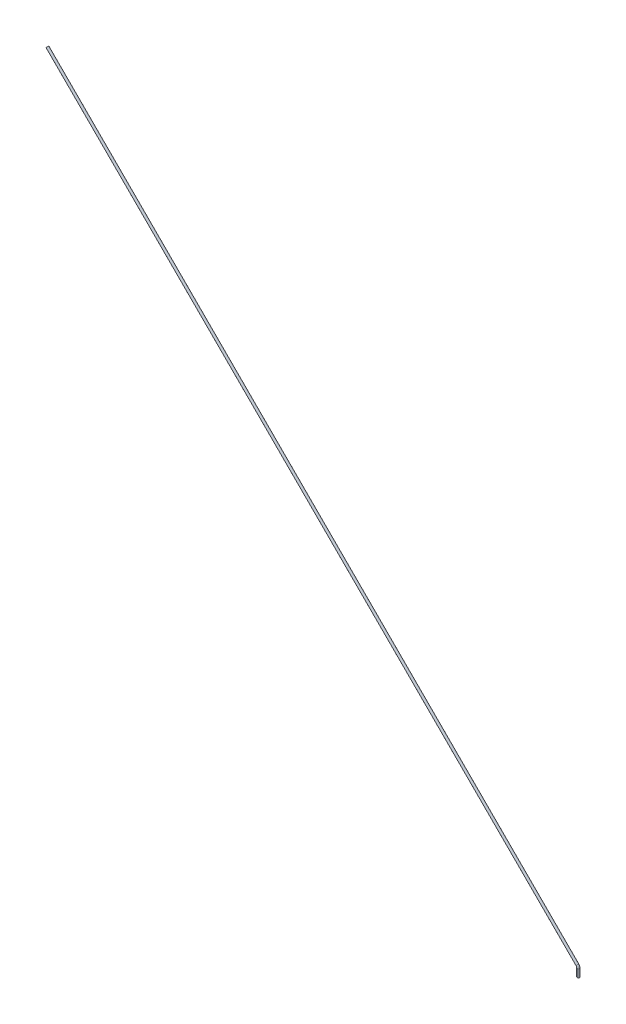
ISO-10303-21;
HEADER;
FILE_DESCRIPTION(('STEP AP214'),'2;1');
FILE_NAME('part.step','',(''),(''),'','','');
FILE_SCHEMA(('AUTOMOTIVE_DESIGN { 1 0 10303 214 1 1 1 1 }'));
ENDSEC;
DATA;
#1=APPLICATION_CONTEXT('core data for automotive mechanical design processes');
#2=APPLICATION_PROTOCOL_DEFINITION('international standard','automotive_design',2000,#1);
#3=PRODUCT_CONTEXT('',#1,'mechanical');
#4=PRODUCT('Part','Part','',(#3));
#5=PRODUCT_RELATED_PRODUCT_CATEGORY('part','',(#4));
#6=PRODUCT_DEFINITION_FORMATION('','',#4);
#7=PRODUCT_DEFINITION_CONTEXT('part definition',#1,'design');
#8=PRODUCT_DEFINITION('design','',#6,#7);
#9=PRODUCT_DEFINITION_SHAPE('','',#8);
#10=(LENGTH_UNIT() NAMED_UNIT(*) SI_UNIT(.MILLI.,.METRE.));
#11=(NAMED_UNIT(*) PLANE_ANGLE_UNIT() SI_UNIT($,.RADIAN.));
#12=(NAMED_UNIT(*) SI_UNIT($,.STERADIAN.) SOLID_ANGLE_UNIT());
#13=UNCERTAINTY_MEASURE_WITH_UNIT(LENGTH_MEASURE(1.E-05),#10,'distance_accuracy_value','');
#14=(GEOMETRIC_REPRESENTATION_CONTEXT(3) GLOBAL_UNCERTAINTY_ASSIGNED_CONTEXT((#13)) GLOBAL_UNIT_ASSIGNED_CONTEXT((#10,
#11,#12)) REPRESENTATION_CONTEXT('',''));
#15=CARTESIAN_POINT('',(0.,0.,0.));
#16=DIRECTION('',(0.,0.,1.));
#17=DIRECTION('',(1.,0.,0.));
#18=AXIS2_PLACEMENT_3D('',#15,#16,#17);
#19=CARTESIAN_POINT('',(-0.21966991411009,2.21966991411009,0.));
#20=DIRECTION('',(-0.707106781186549,0.707106781186546,0.));
#21=DIRECTION('',(-0.707106781186546,-0.707106781186549,0.));
#22=AXIS2_PLACEMENT_3D('',#19,#20,#21);
#23=CYLINDRICAL_SURFACE('',#22,0.25);
#24=CARTESIAN_POINT('',(-0.21966991411009,2.21966991411009,0.));
#25=DIRECTION('',(-0.707106781186549,0.707106781186546,0.));
#26=DIRECTION('',(0.,0.,1.));
#27=AXIS2_PLACEMENT_3D('',#24,#25,#26);
#28=CIRCLE('',#27,0.25);
#29=CARTESIAN_POINT('',(-0.042893218813454,2.39644660940673,0.));
#30=VERTEX_POINT('',#29);
#31=EDGE_CURVE('E37',#30,#30,#28,.T.);
#32=ORIENTED_EDGE('',*,*,#31,.T.);
#33=EDGE_LOOP('',(#32));
#34=FACE_BOUND('',#33,.T.);
#35=CARTESIAN_POINT('',(-115.258405333407,117.258405333407,0.));
#36=DIRECTION('',(-0.707106781186549,0.707106781186546,0.));
#37=DIRECTION('',(0.,0.,1.));
#38=AXIS2_PLACEMENT_3D('',#35,#36,#37);
#39=CIRCLE('',#38,0.25);
#40=CARTESIAN_POINT('',(-115.258405333407,117.258405333407,0.25));
#41=VERTEX_POINT('',#40);
#42=EDGE_CURVE('E10',#41,#41,#39,.T.);
#43=ORIENTED_EDGE('',*,*,#42,.F.);
#44=EDGE_LOOP('',(#43));
#45=FACE_BOUND('',#44,.T.);
#46=ADVANCED_FACE('F31',(#34,#45),#23,.T.);
#47=CARTESIAN_POINT('',(-0.75,1.68933982822018,0.));
#48=DIRECTION('',(0.,0.,1.));
#49=DIRECTION('',(1.,0.,0.));
#50=AXIS2_PLACEMENT_3D('',#47,#48,#49);
#51=TOROIDAL_SURFACE('',#50,0.75,0.25);
#52=CARTESIAN_POINT('',(0.,1.68933982822018,0.));
#53=DIRECTION('',(0.,1.,0.));
#54=DIRECTION('',(0.,0.,1.));
#55=AXIS2_PLACEMENT_3D('',#52,#53,#54);
#56=CIRCLE('',#55,0.25);
#57=CARTESIAN_POINT('',(0.25,1.68933982822018,0.));
#58=VERTEX_POINT('',#57);
#59=EDGE_CURVE('E41',#58,#58,#56,.T.);
#60=CARTESIAN_POINT('',(-0.75,1.68933982822018,0.));
#61=DIRECTION('',(0.,0.,1.));
#62=DIRECTION('',(1.,0.,0.));
#63=AXIS2_PLACEMENT_3D('',#60,#61,#62);
#64=CIRCLE('',#63,1.);
#65=EDGE_CURVE('',#58,#30,#64,.T.);
#66=ORIENTED_EDGE('',*,*,#59,.T.);
#67=ORIENTED_EDGE('',*,*,#31,.F.);
#68=ORIENTED_EDGE('',*,*,#65,.T.);
#69=ORIENTED_EDGE('',*,*,#65,.F.);
#70=EDGE_LOOP('',(#66,#68,#67,#69));
#71=FACE_BOUND('',#70,.T.);
#72=ADVANCED_FACE('F63',(#71),#51,.T.);
#73=CARTESIAN_POINT('',(0.,1.68933982822018,0.));
#74=DIRECTION('',(0.,-1.,0.));
#75=DIRECTION('',(1.,0.,0.));
#76=AXIS2_PLACEMENT_3D('',#73,#74,#75);
#77=CYLINDRICAL_SURFACE('',#76,0.25);
#78=ORIENTED_EDGE('',*,*,#59,.F.);
#79=EDGE_LOOP('',(#78));
#80=FACE_BOUND('',#79,.T.);
#81=CARTESIAN_POINT('',(0.,0.,0.));
#82=DIRECTION('',(0.,1.,0.));
#83=DIRECTION('',(0.,0.,1.));
#84=AXIS2_PLACEMENT_3D('',#81,#82,#83);
#85=CIRCLE('',#84,0.25);
#86=CARTESIAN_POINT('',(0.,0.,0.25));
#87=VERTEX_POINT('',#86);
#88=EDGE_CURVE('E45',#87,#87,#85,.T.);
#89=ORIENTED_EDGE('',*,*,#88,.T.);
#90=EDGE_LOOP('',(#89));
#91=FACE_BOUND('',#90,.T.);
#92=ADVANCED_FACE('F51',(#80,#91),#77,.T.);
#93=CARTESIAN_POINT('',(-115.258405333407,117.258405333407,0.));
#94=DIRECTION('',(-0.707106781186549,0.707106781186546,0.));
#95=DIRECTION('',(0.,0.,1.));
#96=AXIS2_PLACEMENT_3D('',#93,#94,#95);
#97=PLANE('',#96);
#98=ORIENTED_EDGE('',*,*,#42,.T.);
#99=EDGE_LOOP('',(#98));
#100=FACE_BOUND('',#99,.T.);
#101=ADVANCED_FACE('F55',(#100),#97,.T.);
#102=CARTESIAN_POINT('',(0.,0.,0.));
#103=DIRECTION('',(0.,1.,0.));
#104=DIRECTION('',(0.,0.,1.));
#105=AXIS2_PLACEMENT_3D('',#102,#103,#104);
#106=PLANE('',#105);
#107=ORIENTED_EDGE('',*,*,#88,.F.);
#108=EDGE_LOOP('',(#107));
#109=FACE_BOUND('',#108,.T.);
#110=ADVANCED_FACE('F53',(#109),#106,.F.);
#111=CLOSED_SHELL('',(#46,#72,#92,#101,#110));
#112=MANIFOLD_SOLID_BREP('B2',#111);
#113=ADVANCED_BREP_SHAPE_REPRESENTATION('',(#18,#112),#14);
#114=SHAPE_DEFINITION_REPRESENTATION(#9,#113);
ENDSEC;
END-ISO-10303-21;
